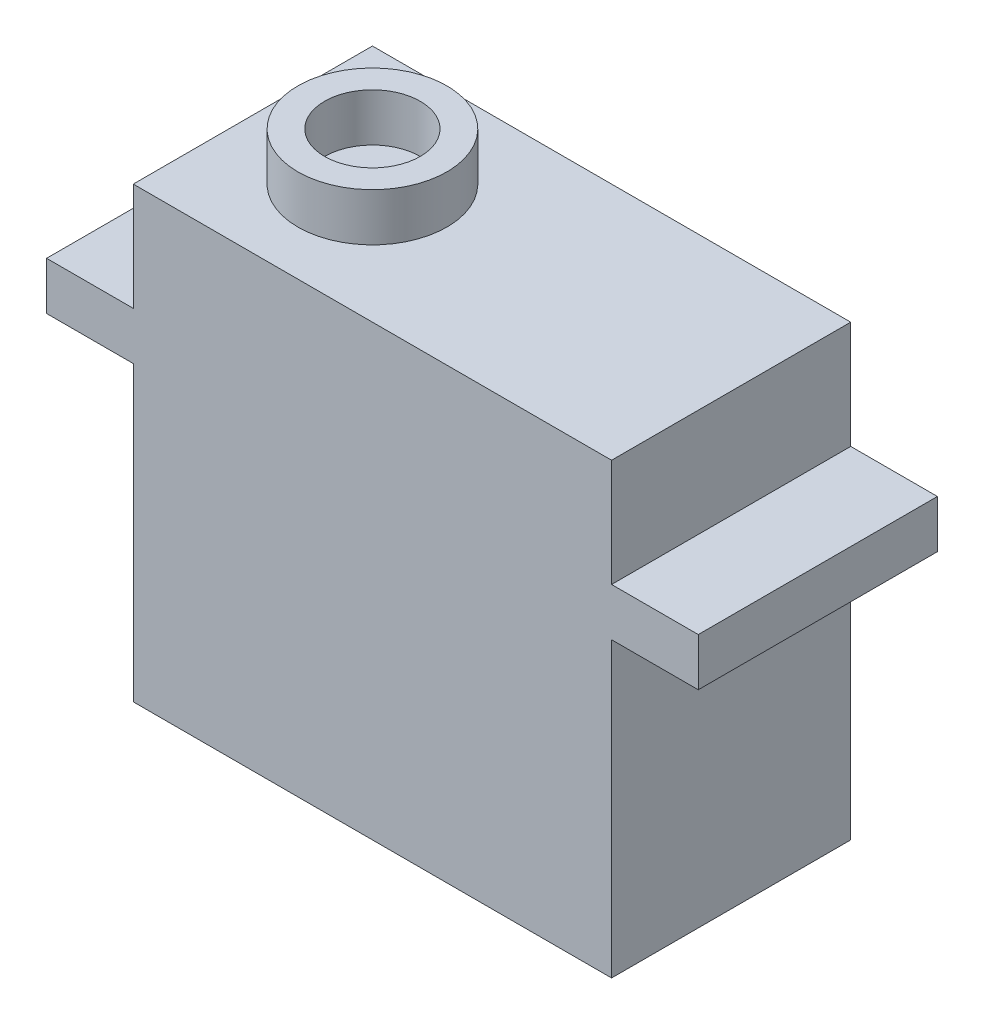
ISO-10303-21;
HEADER;
FILE_DESCRIPTION(('STEP AP214'),'2;1');
FILE_NAME('part.step','',(''),(''),'','','');
FILE_SCHEMA(('AUTOMOTIVE_DESIGN { 1 0 10303 214 1 1 1 1 }'));
ENDSEC;
DATA;
#1=APPLICATION_CONTEXT('core data for automotive mechanical design processes');
#2=APPLICATION_PROTOCOL_DEFINITION('international standard','automotive_design',2000,#1);
#3=PRODUCT_CONTEXT('',#1,'mechanical');
#4=PRODUCT('Part','Part','',(#3));
#5=PRODUCT_RELATED_PRODUCT_CATEGORY('part','',(#4));
#6=PRODUCT_DEFINITION_FORMATION('','',#4);
#7=PRODUCT_DEFINITION_CONTEXT('part definition',#1,'design');
#8=PRODUCT_DEFINITION('design','',#6,#7);
#9=PRODUCT_DEFINITION_SHAPE('','',#8);
#10=(LENGTH_UNIT() NAMED_UNIT(*) SI_UNIT(.MILLI.,.METRE.));
#11=(NAMED_UNIT(*) PLANE_ANGLE_UNIT() SI_UNIT($,.RADIAN.));
#12=(NAMED_UNIT(*) SI_UNIT($,.STERADIAN.) SOLID_ANGLE_UNIT());
#13=UNCERTAINTY_MEASURE_WITH_UNIT(LENGTH_MEASURE(1.E-05),#10,'distance_accuracy_value','');
#14=(GEOMETRIC_REPRESENTATION_CONTEXT(3) GLOBAL_UNCERTAINTY_ASSIGNED_CONTEXT((#13)) GLOBAL_UNIT_ASSIGNED_CONTEXT((#10,
#11,#12)) REPRESENTATION_CONTEXT('',''));
#15=CARTESIAN_POINT('',(0.,0.,0.));
#16=DIRECTION('',(0.,0.,1.));
#17=DIRECTION('',(1.,0.,0.));
#18=AXIS2_PLACEMENT_3D('',#15,#16,#17);
#19=CARTESIAN_POINT('',(0.,28.5,0.));
#20=DIRECTION('',(0.,-1.,0.));
#21=DIRECTION('',(0.,0.,-1.));
#22=AXIS2_PLACEMENT_3D('',#19,#20,#21);
#23=PLANE('',#22);
#24=DIRECTION('',(1.,0.,0.));
#25=VECTOR('',#24,1.);
#26=CARTESIAN_POINT('',(47.25,28.5,0.));
#27=LINE('',#26,#25);
#28=CARTESIAN_POINT('',(-7.25,28.5,0.));
#29=VERTEX_POINT('',#28);
#30=CARTESIAN_POINT('',(0.,28.5,0.));
#31=VERTEX_POINT('',#30);
#32=EDGE_CURVE('E66',#29,#31,#27,.T.);
#33=ORIENTED_EDGE('',*,*,#32,.T.);
#34=DIRECTION('',(0.,0.,-1.));
#35=VECTOR('',#34,1.);
#36=CARTESIAN_POINT('',(0.,28.5,0.));
#37=LINE('',#36,#35);
#38=CARTESIAN_POINT('',(0.,28.5,-20.));
#39=VERTEX_POINT('',#38);
#40=EDGE_CURVE('E61',#31,#39,#37,.T.);
#41=ORIENTED_EDGE('',*,*,#40,.T.);
#42=DIRECTION('',(-1.,0.,0.));
#43=VECTOR('',#42,1.);
#44=CARTESIAN_POINT('',(47.25,28.5,-20.));
#45=LINE('',#44,#43);
#46=CARTESIAN_POINT('',(-7.25,28.5,-20.));
#47=VERTEX_POINT('',#46);
#48=EDGE_CURVE('E179',#39,#47,#45,.T.);
#49=ORIENTED_EDGE('',*,*,#48,.T.);
#50=DIRECTION('',(0.,0.,1.));
#51=VECTOR('',#50,1.);
#52=CARTESIAN_POINT('',(-7.25,28.5,-20.));
#53=LINE('',#52,#51);
#54=EDGE_CURVE('E184',#47,#29,#53,.T.);
#55=ORIENTED_EDGE('',*,*,#54,.T.);
#56=EDGE_LOOP('',(#33,#41,#49,#55));
#57=FACE_BOUND('',#56,.T.);
#58=ADVANCED_FACE('F52',(#57),#23,.F.);
#59=CARTESIAN_POINT('',(0.,24.5,0.));
#60=DIRECTION('',(1.,0.,0.));
#61=DIRECTION('',(0.,0.,-1.));
#62=AXIS2_PLACEMENT_3D('',#59,#60,#61);
#63=PLANE('',#62);
#64=DIRECTION('',(0.,0.,1.));
#65=VECTOR('',#64,1.);
#66=CARTESIAN_POINT('',(0.,0.,0.));
#67=LINE('',#66,#65);
#68=CARTESIAN_POINT('',(0.,0.,-20.));
#69=VERTEX_POINT('',#68);
#70=CARTESIAN_POINT('',(0.,0.,0.));
#71=VERTEX_POINT('',#70);
#72=EDGE_CURVE('E209',#69,#71,#67,.T.);
#73=ORIENTED_EDGE('',*,*,#72,.T.);
#74=DIRECTION('',(0.,-1.,0.));
#75=VECTOR('',#74,1.);
#76=CARTESIAN_POINT('',(0.,24.5,0.));
#77=LINE('',#76,#75);
#78=CARTESIAN_POINT('',(0.,24.5,0.));
#79=VERTEX_POINT('',#78);
#80=EDGE_CURVE('E232',#79,#71,#77,.T.);
#81=ORIENTED_EDGE('',*,*,#80,.F.);
#82=DIRECTION('',(0.,0.,1.));
#83=VECTOR('',#82,1.);
#84=CARTESIAN_POINT('',(0.,24.5,0.));
#85=LINE('',#84,#83);
#86=CARTESIAN_POINT('',(0.,24.5,-20.));
#87=VERTEX_POINT('',#86);
#88=EDGE_CURVE('E211',#87,#79,#85,.T.);
#89=ORIENTED_EDGE('',*,*,#88,.F.);
#90=DIRECTION('',(0.,-1.,0.));
#91=VECTOR('',#90,1.);
#92=CARTESIAN_POINT('',(0.,24.5,-20.));
#93=LINE('',#92,#91);
#94=EDGE_CURVE('E217',#87,#69,#93,.T.);
#95=ORIENTED_EDGE('',*,*,#94,.T.);
#96=EDGE_LOOP('',(#73,#81,#89,#95));
#97=FACE_BOUND('',#96,.T.);
#98=ADVANCED_FACE('F54',(#97),#63,.F.);
#99=CARTESIAN_POINT('',(0.,24.5,0.));
#100=DIRECTION('',(0.,0.,-1.));
#101=DIRECTION('',(-1.,0.,0.));
#102=AXIS2_PLACEMENT_3D('',#99,#100,#101);
#103=PLANE('',#102);
#104=CARTESIAN_POINT('',(40.,28.5,0.));
#105=VERTEX_POINT('',#104);
#106=CARTESIAN_POINT('',(47.25,28.5,0.));
#107=VERTEX_POINT('',#106);
#108=EDGE_CURVE('E186',#105,#107,#27,.T.);
#109=ORIENTED_EDGE('',*,*,#108,.F.);
#110=DIRECTION('',(0.,1.,0.));
#111=VECTOR('',#110,1.);
#112=CARTESIAN_POINT('',(40.,0.,0.));
#113=LINE('',#112,#111);
#114=CARTESIAN_POINT('',(40.,37.5,0.));
#115=VERTEX_POINT('',#114);
#116=EDGE_CURVE('E168',#105,#115,#113,.T.);
#117=ORIENTED_EDGE('',*,*,#116,.T.);
#118=DIRECTION('',(-1.,0.,0.));
#119=VECTOR('',#118,1.);
#120=CARTESIAN_POINT('',(0.,37.5,0.));
#121=LINE('',#120,#119);
#122=CARTESIAN_POINT('',(0.,37.5,0.));
#123=VERTEX_POINT('',#122);
#124=EDGE_CURVE('E160',#115,#123,#121,.T.);
#125=ORIENTED_EDGE('',*,*,#124,.T.);
#126=DIRECTION('',(0.,-1.,0.));
#127=VECTOR('',#126,1.);
#128=CARTESIAN_POINT('',(0.,0.,0.));
#129=LINE('',#128,#127);
#130=EDGE_CURVE('E170',#123,#31,#129,.T.);
#131=ORIENTED_EDGE('',*,*,#130,.T.);
#132=ORIENTED_EDGE('',*,*,#32,.F.);
#133=DIRECTION('',(0.,-1.,0.));
#134=VECTOR('',#133,1.);
#135=CARTESIAN_POINT('',(-7.25,28.5,0.));
#136=LINE('',#135,#134);
#137=CARTESIAN_POINT('',(-7.25,24.5,0.));
#138=VERTEX_POINT('',#137);
#139=EDGE_CURVE('E203',#29,#138,#136,.T.);
#140=ORIENTED_EDGE('',*,*,#139,.T.);
#141=DIRECTION('',(1.,0.,0.));
#142=VECTOR('',#141,1.);
#143=CARTESIAN_POINT('',(47.25,24.5,0.));
#144=LINE('',#143,#142);
#145=EDGE_CURVE('E182',#138,#79,#144,.T.);
#146=ORIENTED_EDGE('',*,*,#145,.T.);
#147=ORIENTED_EDGE('',*,*,#80,.T.);
#148=DIRECTION('',(1.,0.,0.));
#149=VECTOR('',#148,1.);
#150=CARTESIAN_POINT('',(0.,0.,0.));
#151=LINE('',#150,#149);
#152=CARTESIAN_POINT('',(40.,0.,0.));
#153=VERTEX_POINT('',#152);
#154=EDGE_CURVE('E222',#71,#153,#151,.T.);
#155=ORIENTED_EDGE('',*,*,#154,.T.);
#156=DIRECTION('',(0.,-1.,0.));
#157=VECTOR('',#156,1.);
#158=CARTESIAN_POINT('',(40.,24.5,0.));
#159=LINE('',#158,#157);
#160=CARTESIAN_POINT('',(40.,24.5,0.));
#161=VERTEX_POINT('',#160);
#162=EDGE_CURVE('E233',#161,#153,#159,.T.);
#163=ORIENTED_EDGE('',*,*,#162,.F.);
#164=CARTESIAN_POINT('',(47.25,24.5,0.));
#165=VERTEX_POINT('',#164);
#166=EDGE_CURVE('E198',#161,#165,#144,.T.);
#167=ORIENTED_EDGE('',*,*,#166,.T.);
#168=DIRECTION('',(0.,-1.,0.));
#169=VECTOR('',#168,1.);
#170=CARTESIAN_POINT('',(47.25,28.5,0.));
#171=LINE('',#170,#169);
#172=EDGE_CURVE('E187',#107,#165,#171,.T.);
#173=ORIENTED_EDGE('',*,*,#172,.F.);
#174=EDGE_LOOP('',(#109,#117,#125,#131,#132,#140,#146,#147,#155,#163,#167,#173));
#175=FACE_BOUND('',#174,.T.);
#176=ADVANCED_FACE('F240',(#175),#103,.F.);
#177=CARTESIAN_POINT('',(40.,24.5,0.));
#178=DIRECTION('',(-1.,0.,0.));
#179=DIRECTION('',(0.,0.,1.));
#180=AXIS2_PLACEMENT_3D('',#177,#178,#179);
#181=PLANE('',#180);
#182=DIRECTION('',(0.,0.,-1.));
#183=VECTOR('',#182,1.);
#184=CARTESIAN_POINT('',(40.,0.,0.));
#185=LINE('',#184,#183);
#186=CARTESIAN_POINT('',(40.,0.,-20.));
#187=VERTEX_POINT('',#186);
#188=EDGE_CURVE('E224',#153,#187,#185,.T.);
#189=ORIENTED_EDGE('',*,*,#188,.T.);
#190=DIRECTION('',(0.,-1.,0.));
#191=VECTOR('',#190,1.);
#192=CARTESIAN_POINT('',(40.,24.5,-20.));
#193=LINE('',#192,#191);
#194=CARTESIAN_POINT('',(40.,24.5,-20.));
#195=VERTEX_POINT('',#194);
#196=EDGE_CURVE('E227',#195,#187,#193,.T.);
#197=ORIENTED_EDGE('',*,*,#196,.F.);
#198=DIRECTION('',(0.,0.,-1.));
#199=VECTOR('',#198,1.);
#200=CARTESIAN_POINT('',(40.,24.5,0.));
#201=LINE('',#200,#199);
#202=EDGE_CURVE('E212',#161,#195,#201,.T.);
#203=ORIENTED_EDGE('',*,*,#202,.F.);
#204=ORIENTED_EDGE('',*,*,#162,.T.);
#205=EDGE_LOOP('',(#189,#197,#203,#204));
#206=FACE_BOUND('',#205,.T.);
#207=ADVANCED_FACE('F247',(#206),#181,.F.);
#208=CARTESIAN_POINT('',(0.,24.5,-20.));
#209=DIRECTION('',(0.,0.,1.));
#210=DIRECTION('',(1.,0.,0.));
#211=AXIS2_PLACEMENT_3D('',#208,#209,#210);
#212=PLANE('',#211);
#213=DIRECTION('',(-1.,0.,0.));
#214=VECTOR('',#213,1.);
#215=CARTESIAN_POINT('',(47.25,24.5,-20.));
#216=LINE('',#215,#214);
#217=CARTESIAN_POINT('',(47.25,24.5,-20.));
#218=VERTEX_POINT('',#217);
#219=EDGE_CURVE('E192',#218,#195,#216,.T.);
#220=ORIENTED_EDGE('',*,*,#219,.T.);
#221=ORIENTED_EDGE('',*,*,#196,.T.);
#222=DIRECTION('',(-1.,0.,0.));
#223=VECTOR('',#222,1.);
#224=CARTESIAN_POINT('',(0.,0.,-20.));
#225=LINE('',#224,#223);
#226=EDGE_CURVE('E214',#187,#69,#225,.T.);
#227=ORIENTED_EDGE('',*,*,#226,.T.);
#228=ORIENTED_EDGE('',*,*,#94,.F.);
#229=CARTESIAN_POINT('',(-7.25,24.5,-20.));
#230=VERTEX_POINT('',#229);
#231=EDGE_CURVE('E191',#87,#230,#216,.T.);
#232=ORIENTED_EDGE('',*,*,#231,.T.);
#233=DIRECTION('',(0.,-1.,0.));
#234=VECTOR('',#233,1.);
#235=CARTESIAN_POINT('',(-7.25,28.5,-20.));
#236=LINE('',#235,#234);
#237=EDGE_CURVE('E204',#47,#230,#236,.T.);
#238=ORIENTED_EDGE('',*,*,#237,.F.);
#239=ORIENTED_EDGE('',*,*,#48,.F.);
#240=DIRECTION('',(0.,-1.,0.));
#241=VECTOR('',#240,1.);
#242=CARTESIAN_POINT('',(0.,0.,-20.));
#243=LINE('',#242,#241);
#244=CARTESIAN_POINT('',(0.,37.5,-20.));
#245=VERTEX_POINT('',#244);
#246=EDGE_CURVE('E151',#245,#39,#243,.T.);
#247=ORIENTED_EDGE('',*,*,#246,.F.);
#248=DIRECTION('',(-1.,0.,0.));
#249=VECTOR('',#248,1.);
#250=CARTESIAN_POINT('',(0.,37.5,-20.));
#251=LINE('',#250,#249);
#252=CARTESIAN_POINT('',(40.,37.5,-20.));
#253=VERTEX_POINT('',#252);
#254=EDGE_CURVE('E147',#253,#245,#251,.T.);
#255=ORIENTED_EDGE('',*,*,#254,.F.);
#256=DIRECTION('',(0.,1.,0.));
#257=VECTOR('',#256,1.);
#258=CARTESIAN_POINT('',(40.,0.,-20.));
#259=LINE('',#258,#257);
#260=CARTESIAN_POINT('',(40.,28.5,-20.));
#261=VERTEX_POINT('',#260);
#262=EDGE_CURVE('E140',#261,#253,#259,.T.);
#263=ORIENTED_EDGE('',*,*,#262,.F.);
#264=CARTESIAN_POINT('',(47.25,28.5,-20.));
#265=VERTEX_POINT('',#264);
#266=EDGE_CURVE('E185',#265,#261,#45,.T.);
#267=ORIENTED_EDGE('',*,*,#266,.F.);
#268=DIRECTION('',(0.,-1.,0.));
#269=VECTOR('',#268,1.);
#270=CARTESIAN_POINT('',(47.25,28.5,-20.));
#271=LINE('',#270,#269);
#272=EDGE_CURVE('E210',#265,#218,#271,.T.);
#273=ORIENTED_EDGE('',*,*,#272,.T.);
#274=EDGE_LOOP('',(#220,#221,#227,#228,#232,#238,#239,#247,#255,#263,#267,#273));
#275=FACE_BOUND('',#274,.T.);
#276=ADVANCED_FACE('F165',(#275),#212,.F.);
#277=CARTESIAN_POINT('',(0.,0.,0.));
#278=DIRECTION('',(0.,-1.,0.));
#279=DIRECTION('',(0.,0.,-1.));
#280=AXIS2_PLACEMENT_3D('',#277,#278,#279);
#281=PLANE('',#280);
#282=ORIENTED_EDGE('',*,*,#72,.F.);
#283=ORIENTED_EDGE('',*,*,#226,.F.);
#284=ORIENTED_EDGE('',*,*,#188,.F.);
#285=ORIENTED_EDGE('',*,*,#154,.F.);
#286=EDGE_LOOP('',(#282,#283,#284,#285));
#287=FACE_BOUND('',#286,.T.);
#288=ADVANCED_FACE('F243',(#287),#281,.T.);
#289=CARTESIAN_POINT('',(0.,24.5,0.));
#290=DIRECTION('',(0.,-1.,0.));
#291=DIRECTION('',(0.,0.,-1.));
#292=AXIS2_PLACEMENT_3D('',#289,#290,#291);
#293=PLANE('',#292);
#294=ORIENTED_EDGE('',*,*,#231,.F.);
#295=ORIENTED_EDGE('',*,*,#88,.T.);
#296=ORIENTED_EDGE('',*,*,#145,.F.);
#297=DIRECTION('',(0.,0.,1.));
#298=VECTOR('',#297,1.);
#299=CARTESIAN_POINT('',(-7.25,24.5,-20.));
#300=LINE('',#299,#298);
#301=EDGE_CURVE('E193',#230,#138,#300,.T.);
#302=ORIENTED_EDGE('',*,*,#301,.F.);
#303=EDGE_LOOP('',(#294,#295,#296,#302));
#304=FACE_BOUND('',#303,.T.);
#305=ADVANCED_FACE('F308',(#304),#293,.T.);
#306=CARTESIAN_POINT('',(47.25,28.5,-20.));
#307=DIRECTION('',(-1.,0.,0.));
#308=DIRECTION('',(0.,0.,1.));
#309=AXIS2_PLACEMENT_3D('',#306,#307,#308);
#310=PLANE('',#309);
#311=DIRECTION('',(0.,0.,-1.));
#312=VECTOR('',#311,1.);
#313=CARTESIAN_POINT('',(47.25,24.5,-20.));
#314=LINE('',#313,#312);
#315=EDGE_CURVE('E178',#165,#218,#314,.T.);
#316=ORIENTED_EDGE('',*,*,#315,.T.);
#317=ORIENTED_EDGE('',*,*,#272,.F.);
#318=DIRECTION('',(0.,0.,-1.));
#319=VECTOR('',#318,1.);
#320=CARTESIAN_POINT('',(47.25,28.5,-20.));
#321=LINE('',#320,#319);
#322=EDGE_CURVE('E180',#107,#265,#321,.T.);
#323=ORIENTED_EDGE('',*,*,#322,.F.);
#324=ORIENTED_EDGE('',*,*,#172,.T.);
#325=EDGE_LOOP('',(#316,#317,#323,#324));
#326=FACE_BOUND('',#325,.T.);
#327=ADVANCED_FACE('F260',(#326),#310,.F.);
#328=CARTESIAN_POINT('',(-7.25,28.5,-20.));
#329=DIRECTION('',(1.,0.,0.));
#330=DIRECTION('',(0.,0.,-1.));
#331=AXIS2_PLACEMENT_3D('',#328,#329,#330);
#332=PLANE('',#331);
#333=ORIENTED_EDGE('',*,*,#301,.T.);
#334=ORIENTED_EDGE('',*,*,#139,.F.);
#335=ORIENTED_EDGE('',*,*,#54,.F.);
#336=ORIENTED_EDGE('',*,*,#237,.T.);
#337=EDGE_LOOP('',(#333,#334,#335,#336));
#338=FACE_BOUND('',#337,.T.);
#339=ADVANCED_FACE('F301',(#338),#332,.F.);
#340=ORIENTED_EDGE('',*,*,#266,.T.);
#341=DIRECTION('',(0.,0.,1.));
#342=VECTOR('',#341,1.);
#343=CARTESIAN_POINT('',(40.,28.5,0.));
#344=LINE('',#343,#342);
#345=EDGE_CURVE('E150',#261,#105,#344,.T.);
#346=ORIENTED_EDGE('',*,*,#345,.T.);
#347=ORIENTED_EDGE('',*,*,#108,.T.);
#348=ORIENTED_EDGE('',*,*,#322,.T.);
#349=EDGE_LOOP('',(#340,#346,#347,#348));
#350=FACE_BOUND('',#349,.T.);
#351=ADVANCED_FACE('F259',(#350),#23,.F.);
#352=ORIENTED_EDGE('',*,*,#166,.F.);
#353=ORIENTED_EDGE('',*,*,#202,.T.);
#354=ORIENTED_EDGE('',*,*,#219,.F.);
#355=ORIENTED_EDGE('',*,*,#315,.F.);
#356=EDGE_LOOP('',(#352,#353,#354,#355));
#357=FACE_BOUND('',#356,.T.);
#358=ADVANCED_FACE('F251',(#357),#293,.T.);
#359=CARTESIAN_POINT('',(0.,0.,-20.));
#360=DIRECTION('',(-1.,0.,0.));
#361=DIRECTION('',(0.,0.,1.));
#362=AXIS2_PLACEMENT_3D('',#359,#360,#361);
#363=PLANE('',#362);
#364=ORIENTED_EDGE('',*,*,#40,.F.);
#365=ORIENTED_EDGE('',*,*,#130,.F.);
#366=DIRECTION('',(0.,0.,1.));
#367=VECTOR('',#366,1.);
#368=CARTESIAN_POINT('',(0.,37.5,-20.));
#369=LINE('',#368,#367);
#370=EDGE_CURVE('E158',#245,#123,#369,.T.);
#371=ORIENTED_EDGE('',*,*,#370,.F.);
#372=ORIENTED_EDGE('',*,*,#246,.T.);
#373=EDGE_LOOP('',(#364,#365,#371,#372));
#374=FACE_BOUND('',#373,.T.);
#375=ADVANCED_FACE('F265',(#374),#363,.T.);
#376=CARTESIAN_POINT('',(40.,0.,-20.));
#377=DIRECTION('',(1.,0.,0.));
#378=DIRECTION('',(0.,0.,-1.));
#379=AXIS2_PLACEMENT_3D('',#376,#377,#378);
#380=PLANE('',#379);
#381=ORIENTED_EDGE('',*,*,#345,.F.);
#382=ORIENTED_EDGE('',*,*,#262,.T.);
#383=DIRECTION('',(0.,0.,1.));
#384=VECTOR('',#383,1.);
#385=CARTESIAN_POINT('',(40.,37.5,-20.));
#386=LINE('',#385,#384);
#387=EDGE_CURVE('E145',#253,#115,#386,.T.);
#388=ORIENTED_EDGE('',*,*,#387,.T.);
#389=ORIENTED_EDGE('',*,*,#116,.F.);
#390=EDGE_LOOP('',(#381,#382,#388,#389));
#391=FACE_BOUND('',#390,.T.);
#392=ADVANCED_FACE('F142',(#391),#380,.T.);
#393=CARTESIAN_POINT('',(0.,37.5,-20.));
#394=DIRECTION('',(0.,1.,0.));
#395=DIRECTION('',(0.,0.,1.));
#396=AXIS2_PLACEMENT_3D('',#393,#394,#395);
#397=PLANE('',#396);
#398=CARTESIAN_POINT('',(10.,37.5,-10.));
#399=DIRECTION('',(0.,1.,0.));
#400=DIRECTION('',(0.,0.,1.));
#401=AXIS2_PLACEMENT_3D('',#398,#399,#400);
#402=CIRCLE('',#401,6.23252798520376);
#403=CARTESIAN_POINT('',(10.,37.5,-3.76747201479624));
#404=VERTEX_POINT('',#403);
#405=EDGE_CURVE('E262',#404,#404,#402,.T.);
#406=ORIENTED_EDGE('',*,*,#405,.F.);
#407=EDGE_LOOP('',(#406));
#408=FACE_BOUND('',#407,.T.);
#409=ORIENTED_EDGE('',*,*,#124,.F.);
#410=ORIENTED_EDGE('',*,*,#387,.F.);
#411=ORIENTED_EDGE('',*,*,#254,.T.);
#412=ORIENTED_EDGE('',*,*,#370,.T.);
#413=EDGE_LOOP('',(#409,#410,#411,#412));
#414=FACE_BOUND('',#413,.T.);
#415=ADVANCED_FACE('F154',(#408,#414),#397,.T.);
#416=CARTESIAN_POINT('',(10.,41.5,-10.));
#417=DIRECTION('',(0.,1.,0.));
#418=DIRECTION('',(0.,0.,1.));
#419=AXIS2_PLACEMENT_3D('',#416,#417,#418);
#420=PLANE('',#419);
#421=CARTESIAN_POINT('',(10.,41.5,-10.));
#422=DIRECTION('',(0.,1.,0.));
#423=DIRECTION('',(0.,0.,1.));
#424=AXIS2_PLACEMENT_3D('',#421,#422,#423);
#425=CIRCLE('',#424,6.23252798520376);
#426=CARTESIAN_POINT('',(10.,41.5,-3.76747201479624));
#427=VERTEX_POINT('',#426);
#428=EDGE_CURVE('E171',#427,#427,#425,.T.);
#429=ORIENTED_EDGE('',*,*,#428,.T.);
#430=EDGE_LOOP('',(#429));
#431=FACE_BOUND('',#430,.T.);
#432=CARTESIAN_POINT('',(10.,41.5,-10.));
#433=DIRECTION('',(0.,1.,0.));
#434=DIRECTION('',(0.,0.,1.));
#435=AXIS2_PLACEMENT_3D('',#432,#433,#434);
#436=CIRCLE('',#435,4.);
#437=CARTESIAN_POINT('',(10.,41.5,-6.));
#438=VERTEX_POINT('',#437);
#439=EDGE_CURVE('E270',#438,#438,#436,.T.);
#440=ORIENTED_EDGE('',*,*,#439,.F.);
#441=EDGE_LOOP('',(#440));
#442=FACE_BOUND('',#441,.T.);
#443=ADVANCED_FACE('F277',(#431,#442),#420,.T.);
#444=CARTESIAN_POINT('',(10.,41.5,-10.));
#445=DIRECTION('',(0.,-1.,0.));
#446=DIRECTION('',(0.,0.,-1.));
#447=AXIS2_PLACEMENT_3D('',#444,#445,#446);
#448=CYLINDRICAL_SURFACE('',#447,6.23252798520376);
#449=ORIENTED_EDGE('',*,*,#428,.F.);
#450=EDGE_LOOP('',(#449));
#451=FACE_BOUND('',#450,.T.);
#452=ORIENTED_EDGE('',*,*,#405,.T.);
#453=EDGE_LOOP('',(#452));
#454=FACE_BOUND('',#453,.T.);
#455=ADVANCED_FACE('F279',(#451,#454),#448,.T.);
#456=CARTESIAN_POINT('',(10.,41.5,-10.));
#457=DIRECTION('',(0.,-1.,0.));
#458=DIRECTION('',(0.,0.,-1.));
#459=AXIS2_PLACEMENT_3D('',#456,#457,#458);
#460=CYLINDRICAL_SURFACE('',#459,4.);
#461=ORIENTED_EDGE('',*,*,#439,.T.);
#462=EDGE_LOOP('',(#461));
#463=FACE_BOUND('',#462,.T.);
#464=CARTESIAN_POINT('',(10.,37.5,-10.));
#465=DIRECTION('',(0.,1.,0.));
#466=DIRECTION('',(0.,0.,1.));
#467=AXIS2_PLACEMENT_3D('',#464,#465,#466);
#468=CIRCLE('',#467,4.);
#469=CARTESIAN_POINT('',(10.,37.5,-6.));
#470=VERTEX_POINT('',#469);
#471=EDGE_CURVE('E12',#470,#470,#468,.F.);
#472=ORIENTED_EDGE('',*,*,#471,.T.);
#473=EDGE_LOOP('',(#472));
#474=FACE_BOUND('',#473,.T.);
#475=ADVANCED_FACE('F272',(#463,#474),#460,.F.);
#476=ORIENTED_EDGE('',*,*,#471,.F.);
#477=EDGE_LOOP('',(#476));
#478=FACE_BOUND('',#477,.T.);
#479=ADVANCED_FACE('F287',(#478),#397,.T.);
#480=CLOSED_SHELL('',(#58,#98,#176,#207,#276,#288,#305,#327,#339,#351,#358,#375,#392,#415,#443,
#455,#475,#479));
#481=MANIFOLD_SOLID_BREP('B2',#480);
#482=ADVANCED_BREP_SHAPE_REPRESENTATION('',(#18,#481),#14);
#483=SHAPE_DEFINITION_REPRESENTATION(#9,#482);
ENDSEC;
END-ISO-10303-21;
